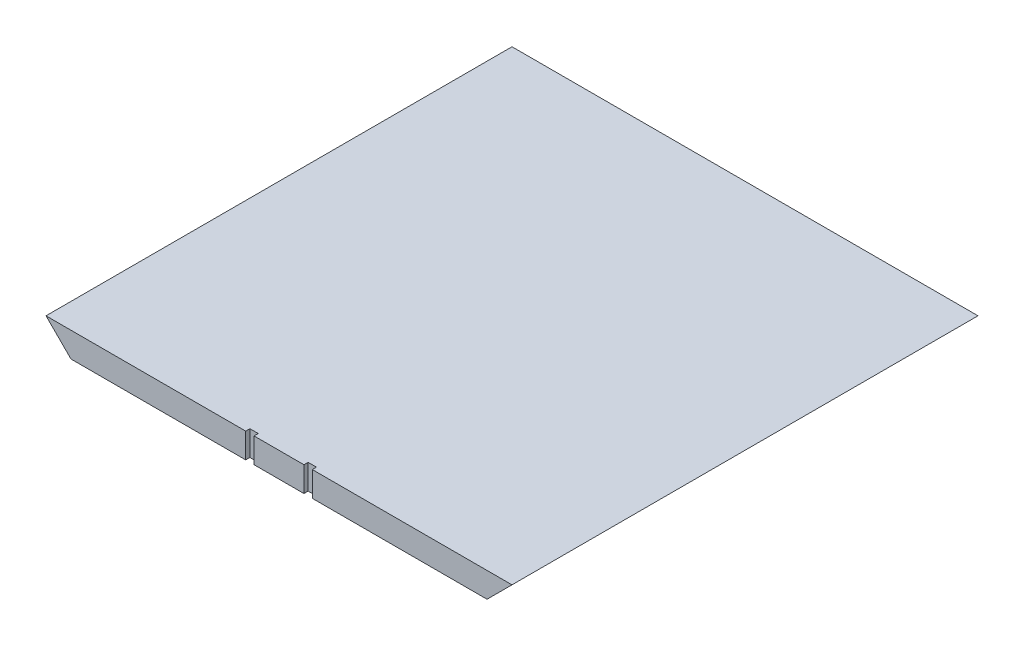
ISO-10303-21;
HEADER;
FILE_DESCRIPTION(('STEP AP214'),'2;1');
FILE_NAME('part.step','',(''),(''),'','','');
FILE_SCHEMA(('AUTOMOTIVE_DESIGN { 1 0 10303 214 1 1 1 1 }'));
ENDSEC;
DATA;
#1=APPLICATION_CONTEXT('core data for automotive mechanical design processes');
#2=APPLICATION_PROTOCOL_DEFINITION('international standard','automotive_design',2000,#1);
#3=PRODUCT_CONTEXT('',#1,'mechanical');
#4=PRODUCT('Part','Part','',(#3));
#5=PRODUCT_RELATED_PRODUCT_CATEGORY('part','',(#4));
#6=PRODUCT_DEFINITION_FORMATION('','',#4);
#7=PRODUCT_DEFINITION_CONTEXT('part definition',#1,'design');
#8=PRODUCT_DEFINITION('design','',#6,#7);
#9=PRODUCT_DEFINITION_SHAPE('','',#8);
#10=(LENGTH_UNIT() NAMED_UNIT(*) SI_UNIT(.MILLI.,.METRE.));
#11=(NAMED_UNIT(*) PLANE_ANGLE_UNIT() SI_UNIT($,.RADIAN.));
#12=(NAMED_UNIT(*) SI_UNIT($,.STERADIAN.) SOLID_ANGLE_UNIT());
#13=UNCERTAINTY_MEASURE_WITH_UNIT(LENGTH_MEASURE(1.E-05),#10,'distance_accuracy_value','');
#14=(GEOMETRIC_REPRESENTATION_CONTEXT(3) GLOBAL_UNCERTAINTY_ASSIGNED_CONTEXT((#13)) GLOBAL_UNIT_ASSIGNED_CONTEXT((#10,
#11,#12)) REPRESENTATION_CONTEXT('',''));
#15=CARTESIAN_POINT('',(0.,0.,0.));
#16=DIRECTION('',(0.,0.,1.));
#17=DIRECTION('',(1.,0.,0.));
#18=AXIS2_PLACEMENT_3D('',#15,#16,#17);
#19=CARTESIAN_POINT('',(177.8,9.525,177.8));
#20=DIRECTION('',(0.,0.,-1.));
#21=DIRECTION('',(-1.,0.,0.));
#22=AXIS2_PLACEMENT_3D('',#19,#20,#21);
#23=PLANE('',#22);
#24=DIRECTION('',(1.,0.,0.));
#25=VECTOR('',#24,1.);
#26=CARTESIAN_POINT('',(177.8,9.525,177.8));
#27=LINE('',#26,#25);
#28=CARTESIAN_POINT('',(-19.0499999999958,9.52500000000017,177.8));
#29=VERTEX_POINT('',#28);
#30=CARTESIAN_POINT('',(19.0500000000041,9.52500000000017,177.8));
#31=VERTEX_POINT('',#30);
#32=EDGE_CURVE('E181',#29,#31,#27,.T.);
#33=ORIENTED_EDGE('',*,*,#32,.F.);
#34=DIRECTION('',(0.,1.,0.));
#35=VECTOR('',#34,1.);
#36=CARTESIAN_POINT('',(-19.0499999999958,9.52500000000017,177.8));
#37=LINE('',#36,#35);
#38=CARTESIAN_POINT('',(-19.0499999999958,-9.525,177.8));
#39=VERTEX_POINT('',#38);
#40=EDGE_CURVE('E136',#39,#29,#37,.T.);
#41=ORIENTED_EDGE('',*,*,#40,.F.);
#42=DIRECTION('',(1.,0.,0.));
#43=VECTOR('',#42,1.);
#44=CARTESIAN_POINT('',(177.8,-9.525,177.8));
#45=LINE('',#44,#43);
#46=CARTESIAN_POINT('',(19.0500000000042,-9.525,177.8));
#47=VERTEX_POINT('',#46);
#48=EDGE_CURVE('E191',#39,#47,#45,.T.);
#49=ORIENTED_EDGE('',*,*,#48,.T.);
#50=DIRECTION('',(0.,-1.,0.));
#51=VECTOR('',#50,1.);
#52=CARTESIAN_POINT('',(19.0500000000041,9.52500000000017,177.8));
#53=LINE('',#52,#51);
#54=EDGE_CURVE('E159',#31,#47,#53,.T.);
#55=ORIENTED_EDGE('',*,*,#54,.F.);
#56=EDGE_LOOP('',(#33,#41,#49,#55));
#57=FACE_BOUND('',#56,.T.);
#58=ADVANCED_FACE('F32',(#57),#23,.F.);
#59=CARTESIAN_POINT('',(25.4000000000041,9.52500000000017,177.8));
#60=VERTEX_POINT('',#59);
#61=CARTESIAN_POINT('',(177.8,9.525,177.8));
#62=VERTEX_POINT('',#61);
#63=EDGE_CURVE('E177',#60,#62,#27,.T.);
#64=ORIENTED_EDGE('',*,*,#63,.F.);
#65=DIRECTION('',(0.,1.,0.));
#66=VECTOR('',#65,1.);
#67=CARTESIAN_POINT('',(25.4000000000041,9.52500000000017,177.8));
#68=LINE('',#67,#66);
#69=CARTESIAN_POINT('',(25.4000000000041,-9.525,177.8));
#70=VERTEX_POINT('',#69);
#71=EDGE_CURVE('E151',#70,#60,#68,.T.);
#72=ORIENTED_EDGE('',*,*,#71,.F.);
#73=CARTESIAN_POINT('',(158.75,-9.525,177.8));
#74=VERTEX_POINT('',#73);
#75=EDGE_CURVE('E167',#70,#74,#45,.T.);
#76=ORIENTED_EDGE('',*,*,#75,.T.);
#77=DIRECTION('',(0.707106781186549,0.707106781186547,0.));
#78=VECTOR('',#77,1.);
#79=CARTESIAN_POINT('',(177.8,9.52499999999996,177.8));
#80=LINE('',#79,#78);
#81=EDGE_CURVE('E11',#74,#62,#80,.T.);
#82=ORIENTED_EDGE('',*,*,#81,.T.);
#83=EDGE_LOOP('',(#64,#72,#76,#82));
#84=FACE_BOUND('',#83,.T.);
#85=ADVANCED_FACE('F239',(#84),#23,.F.);
#86=CARTESIAN_POINT('',(-158.75,-9.525,177.8));
#87=VERTEX_POINT('',#86);
#88=CARTESIAN_POINT('',(-25.3999999999958,-9.525,177.8));
#89=VERTEX_POINT('',#88);
#90=EDGE_CURVE('E188',#87,#89,#45,.T.);
#91=ORIENTED_EDGE('',*,*,#90,.T.);
#92=DIRECTION('',(0.,-1.,0.));
#93=VECTOR('',#92,1.);
#94=CARTESIAN_POINT('',(-25.3999999999958,9.52500000000017,177.8));
#95=LINE('',#94,#93);
#96=CARTESIAN_POINT('',(-25.3999999999958,9.52500000000017,177.8));
#97=VERTEX_POINT('',#96);
#98=EDGE_CURVE('E244',#97,#89,#95,.T.);
#99=ORIENTED_EDGE('',*,*,#98,.F.);
#100=CARTESIAN_POINT('',(-177.8,9.525,177.8));
#101=VERTEX_POINT('',#100);
#102=EDGE_CURVE('E142',#101,#97,#27,.T.);
#103=ORIENTED_EDGE('',*,*,#102,.F.);
#104=DIRECTION('',(0.707106781186548,-0.707106781186547,0.));
#105=VECTOR('',#104,1.);
#106=CARTESIAN_POINT('',(-177.8,9.52499999999997,177.8));
#107=LINE('',#106,#105);
#108=EDGE_CURVE('E40',#101,#87,#107,.T.);
#109=ORIENTED_EDGE('',*,*,#108,.T.);
#110=EDGE_LOOP('',(#91,#99,#103,#109));
#111=FACE_BOUND('',#110,.T.);
#112=ADVANCED_FACE('F203',(#111),#23,.F.);
#113=CARTESIAN_POINT('',(177.8,9.525,-177.8));
#114=DIRECTION('',(0.,0.,1.));
#115=DIRECTION('',(1.,0.,0.));
#116=AXIS2_PLACEMENT_3D('',#113,#114,#115);
#117=PLANE('',#116);
#118=DIRECTION('',(-1.,0.,0.));
#119=VECTOR('',#118,1.);
#120=CARTESIAN_POINT('',(177.8,9.525,-177.8));
#121=LINE('',#120,#119);
#122=CARTESIAN_POINT('',(177.8,9.525,-177.8));
#123=VERTEX_POINT('',#122);
#124=CARTESIAN_POINT('',(-177.8,9.525,-177.8));
#125=VERTEX_POINT('',#124);
#126=EDGE_CURVE('E184',#123,#125,#121,.T.);
#127=ORIENTED_EDGE('',*,*,#126,.F.);
#128=DIRECTION('',(-0.707106781186549,-0.707106781186547,0.));
#129=VECTOR('',#128,1.);
#130=CARTESIAN_POINT('',(177.8,9.52499999999996,-177.8));
#131=LINE('',#130,#129);
#132=CARTESIAN_POINT('',(158.75,-9.525,-177.8));
#133=VERTEX_POINT('',#132);
#134=EDGE_CURVE('E195',#123,#133,#131,.T.);
#135=ORIENTED_EDGE('',*,*,#134,.T.);
#136=DIRECTION('',(-1.,0.,0.));
#137=VECTOR('',#136,1.);
#138=CARTESIAN_POINT('',(177.8,-9.525,-177.8));
#139=LINE('',#138,#137);
#140=CARTESIAN_POINT('',(-158.75,-9.525,-177.8));
#141=VERTEX_POINT('',#140);
#142=EDGE_CURVE('E178',#133,#141,#139,.T.);
#143=ORIENTED_EDGE('',*,*,#142,.T.);
#144=DIRECTION('',(-0.707106781186548,0.707106781186547,0.));
#145=VECTOR('',#144,1.);
#146=CARTESIAN_POINT('',(-177.8,9.52499999999996,-177.8));
#147=LINE('',#146,#145);
#148=EDGE_CURVE('E187',#141,#125,#147,.T.);
#149=ORIENTED_EDGE('',*,*,#148,.T.);
#150=EDGE_LOOP('',(#127,#135,#143,#149));
#151=FACE_BOUND('',#150,.T.);
#152=ADVANCED_FACE('F214',(#151),#117,.F.);
#153=CARTESIAN_POINT('',(0.,9.525,0.));
#154=DIRECTION('',(0.,-1.,0.));
#155=DIRECTION('',(0.,0.,-1.));
#156=AXIS2_PLACEMENT_3D('',#153,#154,#155);
#157=PLANE('',#156);
#158=DIRECTION('',(-1.,0.,0.));
#159=VECTOR('',#158,1.);
#160=CARTESIAN_POINT('',(-25.3999999999958,9.52500000000017,174.625));
#161=LINE('',#160,#159);
#162=CARTESIAN_POINT('',(-19.0499999999958,9.52500000000017,174.625));
#163=VERTEX_POINT('',#162);
#164=CARTESIAN_POINT('',(-25.3999999999958,9.52500000000017,174.625));
#165=VERTEX_POINT('',#164);
#166=EDGE_CURVE('E127',#163,#165,#161,.T.);
#167=ORIENTED_EDGE('',*,*,#166,.F.);
#168=DIRECTION('',(0.,0.,1.));
#169=VECTOR('',#168,1.);
#170=CARTESIAN_POINT('',(-19.0499999999958,9.52500000000017,174.625));
#171=LINE('',#170,#169);
#172=EDGE_CURVE('E162',#163,#29,#171,.T.);
#173=ORIENTED_EDGE('',*,*,#172,.T.);
#174=ORIENTED_EDGE('',*,*,#32,.T.);
#175=DIRECTION('',(0.,0.,1.));
#176=VECTOR('',#175,1.);
#177=CARTESIAN_POINT('',(19.0500000000041,9.52500000000017,174.625));
#178=LINE('',#177,#176);
#179=CARTESIAN_POINT('',(19.0500000000041,9.52500000000017,174.625));
#180=VERTEX_POINT('',#179);
#181=EDGE_CURVE('E158',#180,#31,#178,.T.);
#182=ORIENTED_EDGE('',*,*,#181,.F.);
#183=DIRECTION('',(-1.,0.,0.));
#184=VECTOR('',#183,1.);
#185=CARTESIAN_POINT('',(19.0500000000041,9.52500000000017,174.625));
#186=LINE('',#185,#184);
#187=CARTESIAN_POINT('',(25.4000000000041,9.52500000000017,174.625));
#188=VERTEX_POINT('',#187);
#189=EDGE_CURVE('E149',#188,#180,#186,.T.);
#190=ORIENTED_EDGE('',*,*,#189,.F.);
#191=DIRECTION('',(0.,0.,1.));
#192=VECTOR('',#191,1.);
#193=CARTESIAN_POINT('',(25.4000000000041,9.52500000000017,174.625));
#194=LINE('',#193,#192);
#195=EDGE_CURVE('E164',#188,#60,#194,.T.);
#196=ORIENTED_EDGE('',*,*,#195,.T.);
#197=ORIENTED_EDGE('',*,*,#63,.T.);
#198=DIRECTION('',(0.,0.,-1.));
#199=VECTOR('',#198,1.);
#200=CARTESIAN_POINT('',(177.8,9.525,-177.8));
#201=LINE('',#200,#199);
#202=EDGE_CURVE('E180',#62,#123,#201,.T.);
#203=ORIENTED_EDGE('',*,*,#202,.T.);
#204=ORIENTED_EDGE('',*,*,#126,.T.);
#205=DIRECTION('',(0.,0.,1.));
#206=VECTOR('',#205,1.);
#207=CARTESIAN_POINT('',(-177.8,9.525,-177.8));
#208=LINE('',#207,#206);
#209=EDGE_CURVE('E175',#125,#101,#208,.T.);
#210=ORIENTED_EDGE('',*,*,#209,.T.);
#211=ORIENTED_EDGE('',*,*,#102,.T.);
#212=DIRECTION('',(0.,0.,1.));
#213=VECTOR('',#212,1.);
#214=CARTESIAN_POINT('',(-25.3999999999958,9.52500000000017,174.625));
#215=LINE('',#214,#213);
#216=EDGE_CURVE('E121',#165,#97,#215,.T.);
#217=ORIENTED_EDGE('',*,*,#216,.F.);
#218=EDGE_LOOP('',(#167,#173,#174,#182,#190,#196,#197,#203,#204,#210,#211,#217));
#219=FACE_BOUND('',#218,.T.);
#220=ADVANCED_FACE('F139',(#219),#157,.F.);
#221=CARTESIAN_POINT('',(0.,-9.525,0.));
#222=DIRECTION('',(0.,-1.,0.));
#223=DIRECTION('',(0.,0.,-1.));
#224=AXIS2_PLACEMENT_3D('',#221,#222,#223);
#225=PLANE('',#224);
#226=DIRECTION('',(0.,0.,1.));
#227=VECTOR('',#226,1.);
#228=CARTESIAN_POINT('',(-19.0499999999958,-9.525,174.625));
#229=LINE('',#228,#227);
#230=CARTESIAN_POINT('',(-19.0499999999958,-9.525,174.625));
#231=VERTEX_POINT('',#230);
#232=EDGE_CURVE('E144',#231,#39,#229,.T.);
#233=ORIENTED_EDGE('',*,*,#232,.F.);
#234=DIRECTION('',(1.,0.,0.));
#235=VECTOR('',#234,1.);
#236=CARTESIAN_POINT('',(-25.3999999999958,-9.525,174.625));
#237=LINE('',#236,#235);
#238=CARTESIAN_POINT('',(-25.3999999999958,-9.525,174.625));
#239=VERTEX_POINT('',#238);
#240=EDGE_CURVE('E126',#239,#231,#237,.T.);
#241=ORIENTED_EDGE('',*,*,#240,.F.);
#242=DIRECTION('',(0.,0.,1.));
#243=VECTOR('',#242,1.);
#244=CARTESIAN_POINT('',(-25.3999999999958,-9.525,174.625));
#245=LINE('',#244,#243);
#246=EDGE_CURVE('E124',#239,#89,#245,.T.);
#247=ORIENTED_EDGE('',*,*,#246,.T.);
#248=ORIENTED_EDGE('',*,*,#90,.F.);
#249=DIRECTION('',(0.,0.,-1.));
#250=VECTOR('',#249,1.);
#251=CARTESIAN_POINT('',(-158.75,-9.525,-177.8));
#252=LINE('',#251,#250);
#253=EDGE_CURVE('E197',#87,#141,#252,.T.);
#254=ORIENTED_EDGE('',*,*,#253,.T.);
#255=ORIENTED_EDGE('',*,*,#142,.F.);
#256=DIRECTION('',(0.,0.,1.));
#257=VECTOR('',#256,1.);
#258=CARTESIAN_POINT('',(158.75,-9.525,177.8));
#259=LINE('',#258,#257);
#260=EDGE_CURVE('E199',#133,#74,#259,.T.);
#261=ORIENTED_EDGE('',*,*,#260,.T.);
#262=ORIENTED_EDGE('',*,*,#75,.F.);
#263=DIRECTION('',(0.,0.,1.));
#264=VECTOR('',#263,1.);
#265=CARTESIAN_POINT('',(25.4000000000041,-9.525,174.625));
#266=LINE('',#265,#264);
#267=CARTESIAN_POINT('',(25.4000000000041,-9.525,174.625));
#268=VERTEX_POINT('',#267);
#269=EDGE_CURVE('E168',#268,#70,#266,.T.);
#270=ORIENTED_EDGE('',*,*,#269,.F.);
#271=DIRECTION('',(1.,0.,0.));
#272=VECTOR('',#271,1.);
#273=CARTESIAN_POINT('',(25.4000000000041,-9.525,174.625));
#274=LINE('',#273,#272);
#275=CARTESIAN_POINT('',(19.0500000000041,-9.525,174.625));
#276=VERTEX_POINT('',#275);
#277=EDGE_CURVE('E153',#276,#268,#274,.T.);
#278=ORIENTED_EDGE('',*,*,#277,.F.);
#279=DIRECTION('',(0.,0.,1.));
#280=VECTOR('',#279,1.);
#281=CARTESIAN_POINT('',(19.0500000000042,-9.525,174.625));
#282=LINE('',#281,#280);
#283=EDGE_CURVE('E170',#276,#47,#282,.T.);
#284=ORIENTED_EDGE('',*,*,#283,.T.);
#285=ORIENTED_EDGE('',*,*,#48,.F.);
#286=EDGE_LOOP('',(#233,#241,#247,#248,#254,#255,#261,#262,#270,#278,#284,#285));
#287=FACE_BOUND('',#286,.T.);
#288=ADVANCED_FACE('F209',(#287),#225,.T.);
#289=CARTESIAN_POINT('',(177.8,9.52499999999996,-177.8));
#290=DIRECTION('',(0.707106781186546,-0.707106781186548,0.));
#291=DIRECTION('',(0.,0.,1.));
#292=AXIS2_PLACEMENT_3D('',#289,#290,#291);
#293=PLANE('',#292);
#294=ORIENTED_EDGE('',*,*,#81,.F.);
#295=ORIENTED_EDGE('',*,*,#260,.F.);
#296=ORIENTED_EDGE('',*,*,#134,.F.);
#297=ORIENTED_EDGE('',*,*,#202,.F.);
#298=EDGE_LOOP('',(#294,#295,#296,#297));
#299=FACE_BOUND('',#298,.T.);
#300=ADVANCED_FACE('F219',(#299),#293,.T.);
#301=CARTESIAN_POINT('',(-177.8,9.52499999999996,-177.8));
#302=DIRECTION('',(-0.707106781186547,-0.707106781186548,0.));
#303=DIRECTION('',(0.,0.,-1.));
#304=AXIS2_PLACEMENT_3D('',#301,#302,#303);
#305=PLANE('',#304);
#306=ORIENTED_EDGE('',*,*,#148,.F.);
#307=ORIENTED_EDGE('',*,*,#253,.F.);
#308=ORIENTED_EDGE('',*,*,#108,.F.);
#309=ORIENTED_EDGE('',*,*,#209,.F.);
#310=EDGE_LOOP('',(#306,#307,#308,#309));
#311=FACE_BOUND('',#310,.T.);
#312=ADVANCED_FACE('F34',(#311),#305,.T.);
#313=CARTESIAN_POINT('',(25.4000000000041,9.52500000000017,174.625));
#314=DIRECTION('',(1.,0.,0.));
#315=DIRECTION('',(0.,1.,0.));
#316=AXIS2_PLACEMENT_3D('',#313,#314,#315);
#317=PLANE('',#316);
#318=ORIENTED_EDGE('',*,*,#71,.T.);
#319=ORIENTED_EDGE('',*,*,#195,.F.);
#320=DIRECTION('',(0.,1.,0.));
#321=VECTOR('',#320,1.);
#322=CARTESIAN_POINT('',(25.4000000000041,9.52500000000017,174.625));
#323=LINE('',#322,#321);
#324=EDGE_CURVE('E155',#268,#188,#323,.T.);
#325=ORIENTED_EDGE('',*,*,#324,.F.);
#326=ORIENTED_EDGE('',*,*,#269,.T.);
#327=EDGE_LOOP('',(#318,#319,#325,#326));
#328=FACE_BOUND('',#327,.T.);
#329=ADVANCED_FACE('F238',(#328),#317,.F.);
#330=CARTESIAN_POINT('',(19.0500000000041,9.52500000000017,174.625));
#331=DIRECTION('',(-1.,0.,0.));
#332=DIRECTION('',(0.,-1.,0.));
#333=AXIS2_PLACEMENT_3D('',#330,#331,#332);
#334=PLANE('',#333);
#335=ORIENTED_EDGE('',*,*,#54,.T.);
#336=ORIENTED_EDGE('',*,*,#283,.F.);
#337=DIRECTION('',(0.,-1.,0.));
#338=VECTOR('',#337,1.);
#339=CARTESIAN_POINT('',(19.0500000000041,9.52500000000017,174.625));
#340=LINE('',#339,#338);
#341=EDGE_CURVE('E55',#180,#276,#340,.T.);
#342=ORIENTED_EDGE('',*,*,#341,.F.);
#343=ORIENTED_EDGE('',*,*,#181,.T.);
#344=EDGE_LOOP('',(#335,#336,#342,#343));
#345=FACE_BOUND('',#344,.T.);
#346=ADVANCED_FACE('F232',(#345),#334,.F.);
#347=CARTESIAN_POINT('',(0.,0.,174.625));
#348=DIRECTION('',(0.,0.,-1.));
#349=DIRECTION('',(-1.,0.,0.));
#350=AXIS2_PLACEMENT_3D('',#347,#348,#349);
#351=PLANE('',#350);
#352=ORIENTED_EDGE('',*,*,#189,.T.);
#353=ORIENTED_EDGE('',*,*,#341,.T.);
#354=ORIENTED_EDGE('',*,*,#277,.T.);
#355=ORIENTED_EDGE('',*,*,#324,.T.);
#356=EDGE_LOOP('',(#352,#353,#354,#355));
#357=FACE_BOUND('',#356,.T.);
#358=ADVANCED_FACE('F235',(#357),#351,.F.);
#359=CARTESIAN_POINT('',(-19.0499999999958,9.52500000000017,174.625));
#360=DIRECTION('',(1.,0.,0.));
#361=DIRECTION('',(0.,1.,0.));
#362=AXIS2_PLACEMENT_3D('',#359,#360,#361);
#363=PLANE('',#362);
#364=ORIENTED_EDGE('',*,*,#40,.T.);
#365=ORIENTED_EDGE('',*,*,#172,.F.);
#366=DIRECTION('',(0.,1.,0.));
#367=VECTOR('',#366,1.);
#368=CARTESIAN_POINT('',(-19.0499999999958,9.52500000000017,174.625));
#369=LINE('',#368,#367);
#370=EDGE_CURVE('E133',#231,#163,#369,.T.);
#371=ORIENTED_EDGE('',*,*,#370,.F.);
#372=ORIENTED_EDGE('',*,*,#232,.T.);
#373=EDGE_LOOP('',(#364,#365,#371,#372));
#374=FACE_BOUND('',#373,.T.);
#375=ADVANCED_FACE('F246',(#374),#363,.F.);
#376=CARTESIAN_POINT('',(-25.3999999999958,9.52500000000017,174.625));
#377=DIRECTION('',(-1.,0.,0.));
#378=DIRECTION('',(0.,-1.,0.));
#379=AXIS2_PLACEMENT_3D('',#376,#377,#378);
#380=PLANE('',#379);
#381=ORIENTED_EDGE('',*,*,#98,.T.);
#382=ORIENTED_EDGE('',*,*,#246,.F.);
#383=DIRECTION('',(0.,-1.,0.));
#384=VECTOR('',#383,1.);
#385=CARTESIAN_POINT('',(-25.3999999999958,9.52500000000017,174.625));
#386=LINE('',#385,#384);
#387=EDGE_CURVE('E47',#165,#239,#386,.T.);
#388=ORIENTED_EDGE('',*,*,#387,.F.);
#389=ORIENTED_EDGE('',*,*,#216,.T.);
#390=EDGE_LOOP('',(#381,#382,#388,#389));
#391=FACE_BOUND('',#390,.T.);
#392=ADVANCED_FACE('F119',(#391),#380,.F.);
#393=CARTESIAN_POINT('',(0.,0.,174.625));
#394=DIRECTION('',(0.,0.,-1.));
#395=DIRECTION('',(-1.,0.,0.));
#396=AXIS2_PLACEMENT_3D('',#393,#394,#395);
#397=PLANE('',#396);
#398=ORIENTED_EDGE('',*,*,#166,.T.);
#399=ORIENTED_EDGE('',*,*,#387,.T.);
#400=ORIENTED_EDGE('',*,*,#240,.T.);
#401=ORIENTED_EDGE('',*,*,#370,.T.);
#402=EDGE_LOOP('',(#398,#399,#400,#401));
#403=FACE_BOUND('',#402,.T.);
#404=ADVANCED_FACE('F131',(#403),#397,.F.);
#405=CLOSED_SHELL('',(#58,#85,#112,#152,#220,#288,#300,#312,#329,#346,#358,#375,#392,#404));
#406=MANIFOLD_SOLID_BREP('B2',#405);
#407=ADVANCED_BREP_SHAPE_REPRESENTATION('',(#18,#406),#14);
#408=SHAPE_DEFINITION_REPRESENTATION(#9,#407);
ENDSEC;
END-ISO-10303-21;
